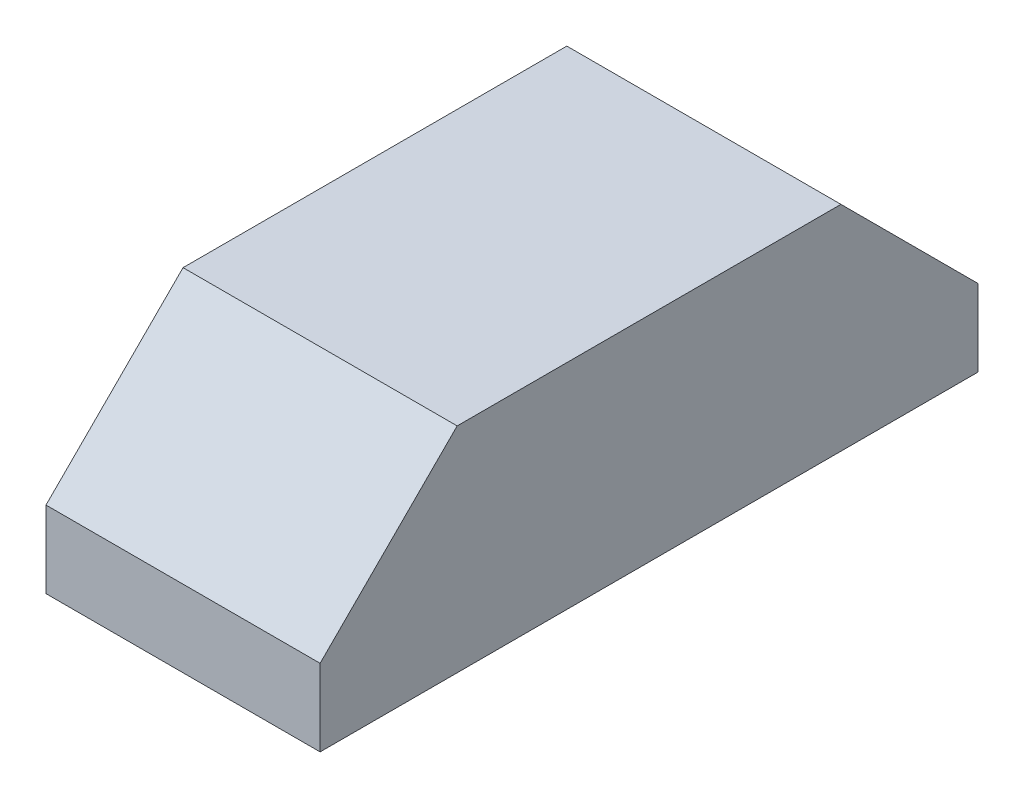
ISO-10303-21;
HEADER;
FILE_DESCRIPTION(('STEP AP214'),'2;1');
FILE_NAME('part.step','',(''),(''),'','','');
FILE_SCHEMA(('AUTOMOTIVE_DESIGN { 1 0 10303 214 1 1 1 1 }'));
ENDSEC;
DATA;
#1=APPLICATION_CONTEXT('core data for automotive mechanical design processes');
#2=APPLICATION_PROTOCOL_DEFINITION('international standard','automotive_design',2000,#1);
#3=PRODUCT_CONTEXT('',#1,'mechanical');
#4=PRODUCT('Part','Part','',(#3));
#5=PRODUCT_RELATED_PRODUCT_CATEGORY('part','',(#4));
#6=PRODUCT_DEFINITION_FORMATION('','',#4);
#7=PRODUCT_DEFINITION_CONTEXT('part definition',#1,'design');
#8=PRODUCT_DEFINITION('design','',#6,#7);
#9=PRODUCT_DEFINITION_SHAPE('','',#8);
#10=(LENGTH_UNIT() NAMED_UNIT(*) SI_UNIT(.MILLI.,.METRE.));
#11=(NAMED_UNIT(*) PLANE_ANGLE_UNIT() SI_UNIT($,.RADIAN.));
#12=(NAMED_UNIT(*) SI_UNIT($,.STERADIAN.) SOLID_ANGLE_UNIT());
#13=UNCERTAINTY_MEASURE_WITH_UNIT(LENGTH_MEASURE(1.E-05),#10,'distance_accuracy_value','');
#14=(GEOMETRIC_REPRESENTATION_CONTEXT(3) GLOBAL_UNCERTAINTY_ASSIGNED_CONTEXT((#13)) GLOBAL_UNIT_ASSIGNED_CONTEXT((#10,
#11,#12)) REPRESENTATION_CONTEXT('',''));
#15=CARTESIAN_POINT('',(0.,0.,0.));
#16=DIRECTION('',(0.,0.,1.));
#17=DIRECTION('',(1.,0.,0.));
#18=AXIS2_PLACEMENT_3D('',#15,#16,#17);
#19=CARTESIAN_POINT('',(5.,0.,19.4943082887037));
#20=DIRECTION('',(0.,0.,-1.));
#21=DIRECTION('',(-1.,0.,0.));
#22=AXIS2_PLACEMENT_3D('',#19,#20,#21);
#23=PLANE('',#22);
#24=DIRECTION('',(0.,-1.,0.));
#25=VECTOR('',#24,1.);
#26=CARTESIAN_POINT('',(0.,0.,19.4943082887037));
#27=LINE('',#26,#25);
#28=CARTESIAN_POINT('',(0.,1.4,19.4943082887037));
#29=VERTEX_POINT('',#28);
#30=CARTESIAN_POINT('',(0.,0.,19.4943082887037));
#31=VERTEX_POINT('',#30);
#32=EDGE_CURVE('E118',#29,#31,#27,.T.);
#33=ORIENTED_EDGE('',*,*,#32,.T.);
#34=DIRECTION('',(-1.,0.,0.));
#35=VECTOR('',#34,1.);
#36=CARTESIAN_POINT('',(5.,0.,19.4943082887037));
#37=LINE('',#36,#35);
#38=CARTESIAN_POINT('',(5.,0.,19.4943082887037));
#39=VERTEX_POINT('',#38);
#40=EDGE_CURVE('E11',#39,#31,#37,.T.);
#41=ORIENTED_EDGE('',*,*,#40,.F.);
#42=DIRECTION('',(0.,-1.,0.));
#43=VECTOR('',#42,1.);
#44=CARTESIAN_POINT('',(5.,0.,19.4943082887037));
#45=LINE('',#44,#43);
#46=CARTESIAN_POINT('',(5.,1.4,19.4943082887037));
#47=VERTEX_POINT('',#46);
#48=EDGE_CURVE('E129',#47,#39,#45,.T.);
#49=ORIENTED_EDGE('',*,*,#48,.F.);
#50=DIRECTION('',(-1.,0.,0.));
#51=VECTOR('',#50,1.);
#52=CARTESIAN_POINT('',(5.,1.4,19.4943082887037));
#53=LINE('',#52,#51);
#54=EDGE_CURVE('E114',#47,#29,#53,.T.);
#55=ORIENTED_EDGE('',*,*,#54,.T.);
#56=EDGE_LOOP('',(#33,#41,#49,#55));
#57=FACE_BOUND('',#56,.T.);
#58=ADVANCED_FACE('F32',(#57),#23,.F.);
#59=CARTESIAN_POINT('',(5.,0.,19.4943082887037));
#60=DIRECTION('',(0.,1.,0.));
#61=DIRECTION('',(0.,0.,1.));
#62=AXIS2_PLACEMENT_3D('',#59,#60,#61);
#63=PLANE('',#62);
#64=CARTESIAN_POINT('',(2.5,0.,13.4943082887037));
#65=DIRECTION('',(0.,-1.,0.));
#66=DIRECTION('',(0.,0.,-1.));
#67=AXIS2_PLACEMENT_3D('',#64,#65,#66);
#68=CIRCLE('',#67,1.49999999999999);
#69=CARTESIAN_POINT('',(2.5,0.,11.9943082887037));
#70=VERTEX_POINT('',#69);
#71=EDGE_CURVE('E224',#70,#70,#68,.T.);
#72=ORIENTED_EDGE('',*,*,#71,.F.);
#73=EDGE_LOOP('',(#72));
#74=FACE_BOUND('',#73,.T.);
#75=DIRECTION('',(0.,0.,-1.));
#76=VECTOR('',#75,1.);
#77=CARTESIAN_POINT('',(0.,0.,19.4943082887037));
#78=LINE('',#77,#76);
#79=CARTESIAN_POINT('',(0.,0.,7.49430828870372));
#80=VERTEX_POINT('',#79);
#81=EDGE_CURVE('E121',#31,#80,#78,.T.);
#82=ORIENTED_EDGE('',*,*,#81,.T.);
#83=DIRECTION('',(-1.,0.,0.));
#84=VECTOR('',#83,1.);
#85=CARTESIAN_POINT('',(5.,0.,7.49430828870372));
#86=LINE('',#85,#84);
#87=CARTESIAN_POINT('',(5.,0.,7.49430828870372));
#88=VERTEX_POINT('',#87);
#89=EDGE_CURVE('E40',#88,#80,#86,.T.);
#90=ORIENTED_EDGE('',*,*,#89,.F.);
#91=DIRECTION('',(0.,0.,-1.));
#92=VECTOR('',#91,1.);
#93=CARTESIAN_POINT('',(5.,0.,19.4943082887037));
#94=LINE('',#93,#92);
#95=EDGE_CURVE('E86',#39,#88,#94,.T.);
#96=ORIENTED_EDGE('',*,*,#95,.F.);
#97=ORIENTED_EDGE('',*,*,#40,.T.);
#98=EDGE_LOOP('',(#82,#90,#96,#97));
#99=FACE_BOUND('',#98,.T.);
#100=ADVANCED_FACE('F153',(#74,#99),#63,.F.);
#101=CARTESIAN_POINT('',(5.,0.,7.49430828870372));
#102=DIRECTION('',(0.,0.,1.));
#103=DIRECTION('',(1.,0.,0.));
#104=AXIS2_PLACEMENT_3D('',#101,#102,#103);
#105=PLANE('',#104);
#106=DIRECTION('',(0.,1.,0.));
#107=VECTOR('',#106,1.);
#108=CARTESIAN_POINT('',(0.,0.,7.49430828870372));
#109=LINE('',#108,#107);
#110=CARTESIAN_POINT('',(0.,1.4,7.49430828870372));
#111=VERTEX_POINT('',#110);
#112=EDGE_CURVE('E124',#80,#111,#109,.T.);
#113=ORIENTED_EDGE('',*,*,#112,.T.);
#114=DIRECTION('',(-1.,0.,0.));
#115=VECTOR('',#114,1.);
#116=CARTESIAN_POINT('',(5.,1.4,7.49430828870372));
#117=LINE('',#116,#115);
#118=CARTESIAN_POINT('',(5.,1.4,7.49430828870372));
#119=VERTEX_POINT('',#118);
#120=EDGE_CURVE('E109',#119,#111,#117,.T.);
#121=ORIENTED_EDGE('',*,*,#120,.F.);
#122=DIRECTION('',(0.,1.,0.));
#123=VECTOR('',#122,1.);
#124=CARTESIAN_POINT('',(5.,0.,7.49430828870372));
#125=LINE('',#124,#123);
#126=EDGE_CURVE('E100',#88,#119,#125,.T.);
#127=ORIENTED_EDGE('',*,*,#126,.F.);
#128=ORIENTED_EDGE('',*,*,#89,.T.);
#129=EDGE_LOOP('',(#113,#121,#127,#128));
#130=FACE_BOUND('',#129,.T.);
#131=ADVANCED_FACE('F135',(#130),#105,.F.);
#132=CARTESIAN_POINT('',(5.,3.90000000000001,9.99430828870372));
#133=DIRECTION('',(0.,-0.707106781186546,0.707106781186549));
#134=DIRECTION('',(0.,-0.707106781186549,-0.707106781186546));
#135=AXIS2_PLACEMENT_3D('',#132,#133,#134);
#136=PLANE('',#135);
#137=DIRECTION('',(0.,0.707106781186549,0.707106781186546));
#138=VECTOR('',#137,1.);
#139=CARTESIAN_POINT('',(0.,3.90000000000001,9.99430828870372));
#140=LINE('',#139,#138);
#141=CARTESIAN_POINT('',(0.,3.90000000000001,9.99430828870372));
#142=VERTEX_POINT('',#141);
#143=EDGE_CURVE('E108',#111,#142,#140,.T.);
#144=ORIENTED_EDGE('',*,*,#143,.T.);
#145=DIRECTION('',(-1.,0.,0.));
#146=VECTOR('',#145,1.);
#147=CARTESIAN_POINT('',(5.,3.90000000000001,9.99430828870372));
#148=LINE('',#147,#146);
#149=CARTESIAN_POINT('',(5.,3.90000000000001,9.99430828870372));
#150=VERTEX_POINT('',#149);
#151=EDGE_CURVE('E105',#150,#142,#148,.T.);
#152=ORIENTED_EDGE('',*,*,#151,.F.);
#153=DIRECTION('',(0.,0.707106781186549,0.707106781186546));
#154=VECTOR('',#153,1.);
#155=CARTESIAN_POINT('',(5.,3.90000000000001,9.99430828870372));
#156=LINE('',#155,#154);
#157=EDGE_CURVE('E94',#119,#150,#156,.T.);
#158=ORIENTED_EDGE('',*,*,#157,.F.);
#159=ORIENTED_EDGE('',*,*,#120,.T.);
#160=EDGE_LOOP('',(#144,#152,#158,#159));
#161=FACE_BOUND('',#160,.T.);
#162=ADVANCED_FACE('F106',(#161),#136,.F.);
#163=CARTESIAN_POINT('',(5.,3.90000000000001,16.9943082887037));
#164=DIRECTION('',(0.,-1.,0.));
#165=DIRECTION('',(0.,0.,-1.));
#166=AXIS2_PLACEMENT_3D('',#163,#164,#165);
#167=PLANE('',#166);
#168=DIRECTION('',(0.,0.,1.));
#169=VECTOR('',#168,1.);
#170=CARTESIAN_POINT('',(0.,3.90000000000001,16.9943082887037));
#171=LINE('',#170,#169);
#172=CARTESIAN_POINT('',(0.,3.90000000000001,16.9943082887037));
#173=VERTEX_POINT('',#172);
#174=EDGE_CURVE('E72',#142,#173,#171,.T.);
#175=ORIENTED_EDGE('',*,*,#174,.T.);
#176=DIRECTION('',(-1.,0.,0.));
#177=VECTOR('',#176,1.);
#178=CARTESIAN_POINT('',(5.,3.90000000000001,16.9943082887037));
#179=LINE('',#178,#177);
#180=CARTESIAN_POINT('',(5.,3.90000000000001,16.9943082887037));
#181=VERTEX_POINT('',#180);
#182=EDGE_CURVE('E110',#181,#173,#179,.T.);
#183=ORIENTED_EDGE('',*,*,#182,.F.);
#184=DIRECTION('',(0.,0.,1.));
#185=VECTOR('',#184,1.);
#186=CARTESIAN_POINT('',(5.,3.90000000000001,16.9943082887037));
#187=LINE('',#186,#185);
#188=EDGE_CURVE('E98',#150,#181,#187,.T.);
#189=ORIENTED_EDGE('',*,*,#188,.F.);
#190=ORIENTED_EDGE('',*,*,#151,.T.);
#191=EDGE_LOOP('',(#175,#183,#189,#190));
#192=FACE_BOUND('',#191,.T.);
#193=ADVANCED_FACE('F112',(#192),#167,.F.);
#194=CARTESIAN_POINT('',(5.,1.4,19.4943082887037));
#195=DIRECTION('',(0.,-0.707106781186546,-0.707106781186549));
#196=DIRECTION('',(0.,0.707106781186549,-0.707106781186546));
#197=AXIS2_PLACEMENT_3D('',#194,#195,#196);
#198=PLANE('',#197);
#199=DIRECTION('',(0.,-0.707106781186549,0.707106781186546));
#200=VECTOR('',#199,1.);
#201=CARTESIAN_POINT('',(0.,1.4,19.4943082887037));
#202=LINE('',#201,#200);
#203=EDGE_CURVE('E78',#173,#29,#202,.T.);
#204=ORIENTED_EDGE('',*,*,#203,.T.);
#205=ORIENTED_EDGE('',*,*,#54,.F.);
#206=DIRECTION('',(0.,-0.707106781186549,0.707106781186546));
#207=VECTOR('',#206,1.);
#208=CARTESIAN_POINT('',(5.,1.4,19.4943082887037));
#209=LINE('',#208,#207);
#210=EDGE_CURVE('E48',#181,#47,#209,.T.);
#211=ORIENTED_EDGE('',*,*,#210,.F.);
#212=ORIENTED_EDGE('',*,*,#182,.T.);
#213=EDGE_LOOP('',(#204,#205,#211,#212));
#214=FACE_BOUND('',#213,.T.);
#215=ADVANCED_FACE('F142',(#214),#198,.F.);
#216=CARTESIAN_POINT('',(5.,0.,0.));
#217=DIRECTION('',(-1.,0.,0.));
#218=DIRECTION('',(0.,0.,1.));
#219=AXIS2_PLACEMENT_3D('',#216,#217,#218);
#220=PLANE('',#219);
#221=ORIENTED_EDGE('',*,*,#48,.T.);
#222=ORIENTED_EDGE('',*,*,#95,.T.);
#223=ORIENTED_EDGE('',*,*,#126,.T.);
#224=ORIENTED_EDGE('',*,*,#157,.T.);
#225=ORIENTED_EDGE('',*,*,#188,.T.);
#226=ORIENTED_EDGE('',*,*,#210,.T.);
#227=EDGE_LOOP('',(#221,#222,#223,#224,#225,#226));
#228=FACE_BOUND('',#227,.T.);
#229=ADVANCED_FACE('F96',(#228),#220,.F.);
#230=CARTESIAN_POINT('',(0.,0.,0.));
#231=DIRECTION('',(-1.,0.,0.));
#232=DIRECTION('',(0.,0.,1.));
#233=AXIS2_PLACEMENT_3D('',#230,#231,#232);
#234=PLANE('',#233);
#235=ORIENTED_EDGE('',*,*,#32,.F.);
#236=ORIENTED_EDGE('',*,*,#203,.F.);
#237=ORIENTED_EDGE('',*,*,#174,.F.);
#238=ORIENTED_EDGE('',*,*,#143,.F.);
#239=ORIENTED_EDGE('',*,*,#112,.F.);
#240=ORIENTED_EDGE('',*,*,#81,.F.);
#241=EDGE_LOOP('',(#235,#236,#237,#238,#239,#240));
#242=FACE_BOUND('',#241,.T.);
#243=ADVANCED_FACE('F138',(#242),#234,.T.);
#244=CARTESIAN_POINT('',(2.5,2.,13.4943082887037));
#245=DIRECTION('',(0.,-1.,0.));
#246=DIRECTION('',(0.,0.,-1.));
#247=AXIS2_PLACEMENT_3D('',#244,#245,#246);
#248=CONICAL_SURFACE('',#247,1.5,1.02974425867665);
#249=CARTESIAN_POINT('',(2.5,2.90129092854134,13.4943082887037));
#250=VERTEX_POINT('',#249);
#251=VERTEX_LOOP('',#250);
#252=FACE_BOUND('',#251,.T.);
#253=CARTESIAN_POINT('',(2.5,2.,13.4943082887037));
#254=DIRECTION('',(0.,-1.,0.));
#255=DIRECTION('',(0.,0.,-1.));
#256=AXIS2_PLACEMENT_3D('',#253,#254,#255);
#257=CIRCLE('',#256,1.5);
#258=CARTESIAN_POINT('',(2.5,2.,11.9943082887037));
#259=VERTEX_POINT('',#258);
#260=EDGE_CURVE('E122',#259,#259,#257,.T.);
#261=ORIENTED_EDGE('',*,*,#260,.T.);
#262=EDGE_LOOP('',(#261));
#263=FACE_BOUND('',#262,.T.);
#264=ADVANCED_FACE('F191',(#252,#263),#248,.F.);
#265=CARTESIAN_POINT('',(2.5,0.,13.4943082887037));
#266=DIRECTION('',(0.,-1.,0.));
#267=DIRECTION('',(0.,0.,-1.));
#268=AXIS2_PLACEMENT_3D('',#265,#266,#267);
#269=CYLINDRICAL_SURFACE('',#268,1.5);
#270=ORIENTED_EDGE('',*,*,#260,.F.);
#271=EDGE_LOOP('',(#270));
#272=FACE_BOUND('',#271,.T.);
#273=ORIENTED_EDGE('',*,*,#71,.T.);
#274=EDGE_LOOP('',(#273));
#275=FACE_BOUND('',#274,.T.);
#276=ADVANCED_FACE('F206',(#272,#275),#269,.F.);
#277=CLOSED_SHELL('',(#58,#100,#131,#162,#193,#215,#229,#243,#264,#276));
#278=MANIFOLD_SOLID_BREP('B2',#277);
#279=ADVANCED_BREP_SHAPE_REPRESENTATION('',(#18,#278),#14);
#280=SHAPE_DEFINITION_REPRESENTATION(#9,#279);
ENDSEC;
END-ISO-10303-21;
